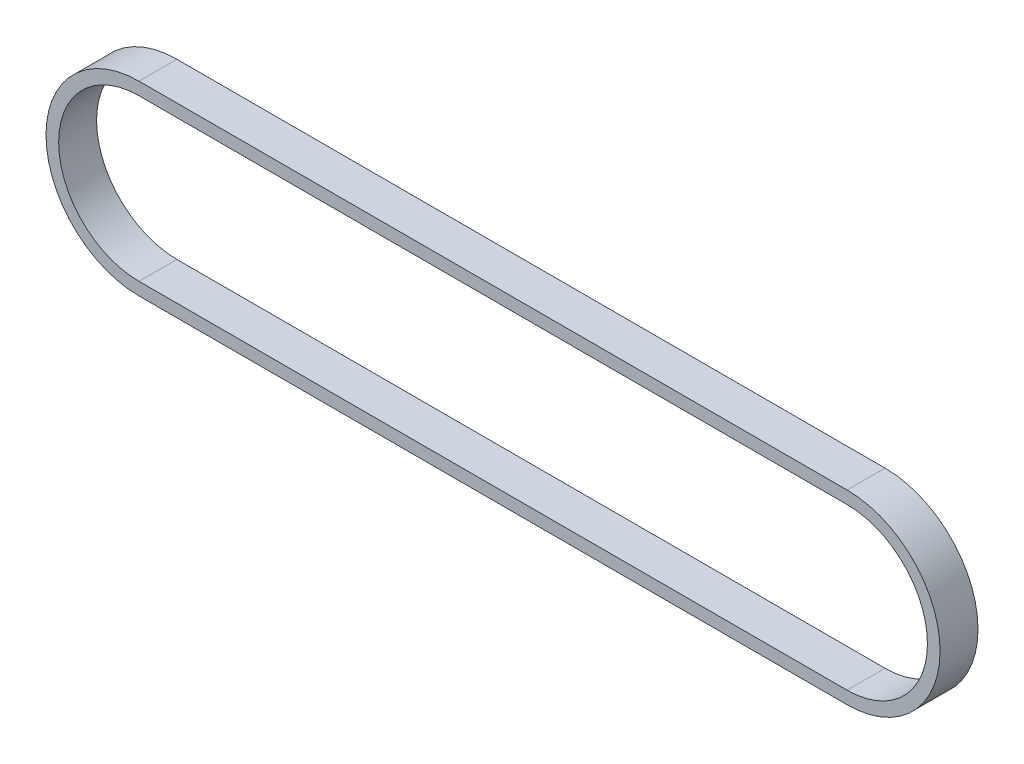
ISO-10303-21;
HEADER;
FILE_DESCRIPTION(('STEP AP214'),'2;1');
FILE_NAME('part.step','',(''),(''),'','','');
FILE_SCHEMA(('AUTOMOTIVE_DESIGN { 1 0 10303 214 1 1 1 1 }'));
ENDSEC;
DATA;
#1=APPLICATION_CONTEXT('core data for automotive mechanical design processes');
#2=APPLICATION_PROTOCOL_DEFINITION('international standard','automotive_design',2000,#1);
#3=PRODUCT_CONTEXT('',#1,'mechanical');
#4=PRODUCT('Part','Part','',(#3));
#5=PRODUCT_RELATED_PRODUCT_CATEGORY('part','',(#4));
#6=PRODUCT_DEFINITION_FORMATION('','',#4);
#7=PRODUCT_DEFINITION_CONTEXT('part definition',#1,'design');
#8=PRODUCT_DEFINITION('design','',#6,#7);
#9=PRODUCT_DEFINITION_SHAPE('','',#8);
#10=(LENGTH_UNIT() NAMED_UNIT(*) SI_UNIT(.MILLI.,.METRE.));
#11=(NAMED_UNIT(*) PLANE_ANGLE_UNIT() SI_UNIT($,.RADIAN.));
#12=(NAMED_UNIT(*) SI_UNIT($,.STERADIAN.) SOLID_ANGLE_UNIT());
#13=UNCERTAINTY_MEASURE_WITH_UNIT(LENGTH_MEASURE(1.E-05),#10,'distance_accuracy_value','');
#14=(GEOMETRIC_REPRESENTATION_CONTEXT(3) GLOBAL_UNCERTAINTY_ASSIGNED_CONTEXT((#13)) GLOBAL_UNIT_ASSIGNED_CONTEXT((#10,
#11,#12)) REPRESENTATION_CONTEXT('',''));
#15=CARTESIAN_POINT('',(0.,0.,0.));
#16=DIRECTION('',(0.,0.,1.));
#17=DIRECTION('',(1.,0.,0.));
#18=AXIS2_PLACEMENT_3D('',#15,#16,#17);
#19=CARTESIAN_POINT('',(0.,0.,6.));
#20=DIRECTION('',(0.,0.,1.));
#21=DIRECTION('',(1.,0.,0.));
#22=AXIS2_PLACEMENT_3D('',#19,#20,#21);
#23=PLANE('',#22);
#24=CARTESIAN_POINT('',(0.,0.,6.));
#25=DIRECTION('',(0.,0.,1.));
#26=DIRECTION('',(1.,0.,0.));
#27=AXIS2_PLACEMENT_3D('',#24,#25,#26);
#28=CIRCLE('',#27,14.71);
#29=CARTESIAN_POINT('',(0.,14.71,6.));
#30=VERTEX_POINT('',#29);
#31=CARTESIAN_POINT('',(0.,-14.71,6.));
#32=VERTEX_POINT('',#31);
#33=EDGE_CURVE('E134',#30,#32,#28,.T.);
#34=ORIENTED_EDGE('',*,*,#33,.T.);
#35=DIRECTION('',(1.,0.,0.));
#36=VECTOR('',#35,1.);
#37=CARTESIAN_POINT('',(0.,-14.71,6.));
#38=LINE('',#37,#36);
#39=CARTESIAN_POINT('',(112.,-14.71,6.));
#40=VERTEX_POINT('',#39);
#41=EDGE_CURVE('E137',#32,#40,#38,.T.);
#42=ORIENTED_EDGE('',*,*,#41,.T.);
#43=CARTESIAN_POINT('',(112.,0.,6.));
#44=DIRECTION('',(0.,0.,1.));
#45=DIRECTION('',(1.,0.,0.));
#46=AXIS2_PLACEMENT_3D('',#43,#44,#45);
#47=CIRCLE('',#46,14.71);
#48=CARTESIAN_POINT('',(112.,14.71,6.));
#49=VERTEX_POINT('',#48);
#50=EDGE_CURVE('E140',#40,#49,#47,.T.);
#51=ORIENTED_EDGE('',*,*,#50,.T.);
#52=DIRECTION('',(-1.,0.,0.));
#53=VECTOR('',#52,1.);
#54=CARTESIAN_POINT('',(0.,14.71,6.));
#55=LINE('',#54,#53);
#56=EDGE_CURVE('E142',#49,#30,#55,.T.);
#57=ORIENTED_EDGE('',*,*,#56,.T.);
#58=EDGE_LOOP('',(#34,#42,#51,#57));
#59=FACE_BOUND('',#58,.T.);
#60=DIRECTION('',(1.,0.,0.));
#61=VECTOR('',#60,1.);
#62=CARTESIAN_POINT('',(0.,-12.71,6.));
#63=LINE('',#62,#61);
#64=CARTESIAN_POINT('',(0.,-12.71,6.));
#65=VERTEX_POINT('',#64);
#66=CARTESIAN_POINT('',(112.,-12.71,6.));
#67=VERTEX_POINT('',#66);
#68=EDGE_CURVE('E106',#65,#67,#63,.T.);
#69=ORIENTED_EDGE('',*,*,#68,.F.);
#70=CARTESIAN_POINT('',(0.,0.,6.));
#71=DIRECTION('',(0.,0.,1.));
#72=DIRECTION('',(1.,0.,0.));
#73=AXIS2_PLACEMENT_3D('',#70,#71,#72);
#74=CIRCLE('',#73,12.71);
#75=CARTESIAN_POINT('',(0.,12.71,6.));
#76=VERTEX_POINT('',#75);
#77=EDGE_CURVE('E98',#76,#65,#74,.T.);
#78=ORIENTED_EDGE('',*,*,#77,.F.);
#79=DIRECTION('',(-1.,0.,0.));
#80=VECTOR('',#79,1.);
#81=CARTESIAN_POINT('',(0.,12.71,6.));
#82=LINE('',#81,#80);
#83=CARTESIAN_POINT('',(112.,12.71,6.));
#84=VERTEX_POINT('',#83);
#85=EDGE_CURVE('E120',#84,#76,#82,.T.);
#86=ORIENTED_EDGE('',*,*,#85,.F.);
#87=CARTESIAN_POINT('',(112.,0.,6.));
#88=DIRECTION('',(0.,0.,1.));
#89=DIRECTION('',(1.,0.,0.));
#90=AXIS2_PLACEMENT_3D('',#87,#88,#89);
#91=CIRCLE('',#90,12.71);
#92=EDGE_CURVE('E118',#67,#84,#91,.T.);
#93=ORIENTED_EDGE('',*,*,#92,.F.);
#94=EDGE_LOOP('',(#69,#78,#86,#93));
#95=FACE_BOUND('',#94,.T.);
#96=ADVANCED_FACE('F33',(#59,#95),#23,.T.);
#97=CARTESIAN_POINT('',(0.,0.,0.));
#98=DIRECTION('',(0.,0.,1.));
#99=DIRECTION('',(1.,0.,0.));
#100=AXIS2_PLACEMENT_3D('',#97,#98,#99);
#101=PLANE('',#100);
#102=CARTESIAN_POINT('',(0.,0.,0.));
#103=DIRECTION('',(0.,0.,1.));
#104=DIRECTION('',(1.,0.,0.));
#105=AXIS2_PLACEMENT_3D('',#102,#103,#104);
#106=CIRCLE('',#105,14.71);
#107=CARTESIAN_POINT('',(0.,14.71,0.));
#108=VERTEX_POINT('',#107);
#109=CARTESIAN_POINT('',(0.,-14.71,0.));
#110=VERTEX_POINT('',#109);
#111=EDGE_CURVE('E114',#108,#110,#106,.T.);
#112=ORIENTED_EDGE('',*,*,#111,.F.);
#113=DIRECTION('',(-1.,0.,0.));
#114=VECTOR('',#113,1.);
#115=CARTESIAN_POINT('',(0.,14.71,0.));
#116=LINE('',#115,#114);
#117=CARTESIAN_POINT('',(112.,14.71,0.));
#118=VERTEX_POINT('',#117);
#119=EDGE_CURVE('E138',#118,#108,#116,.T.);
#120=ORIENTED_EDGE('',*,*,#119,.F.);
#121=CARTESIAN_POINT('',(112.,0.,0.));
#122=DIRECTION('',(0.,0.,1.));
#123=DIRECTION('',(1.,0.,0.));
#124=AXIS2_PLACEMENT_3D('',#121,#122,#123);
#125=CIRCLE('',#124,14.71);
#126=CARTESIAN_POINT('',(112.,-14.71,0.));
#127=VERTEX_POINT('',#126);
#128=EDGE_CURVE('E149',#127,#118,#125,.T.);
#129=ORIENTED_EDGE('',*,*,#128,.F.);
#130=DIRECTION('',(1.,0.,0.));
#131=VECTOR('',#130,1.);
#132=CARTESIAN_POINT('',(0.,-14.71,0.));
#133=LINE('',#132,#131);
#134=EDGE_CURVE('E147',#110,#127,#133,.T.);
#135=ORIENTED_EDGE('',*,*,#134,.F.);
#136=EDGE_LOOP('',(#112,#120,#129,#135));
#137=FACE_BOUND('',#136,.T.);
#138=CARTESIAN_POINT('',(0.,0.,0.));
#139=DIRECTION('',(0.,0.,1.));
#140=DIRECTION('',(1.,0.,0.));
#141=AXIS2_PLACEMENT_3D('',#138,#139,#140);
#142=CIRCLE('',#141,12.71);
#143=CARTESIAN_POINT('',(0.,12.71,0.));
#144=VERTEX_POINT('',#143);
#145=CARTESIAN_POINT('',(0.,-12.71,0.));
#146=VERTEX_POINT('',#145);
#147=EDGE_CURVE('E56',#144,#146,#142,.T.);
#148=ORIENTED_EDGE('',*,*,#147,.T.);
#149=DIRECTION('',(1.,0.,0.));
#150=VECTOR('',#149,1.);
#151=CARTESIAN_POINT('',(0.,-12.71,0.));
#152=LINE('',#151,#150);
#153=CARTESIAN_POINT('',(112.,-12.71,0.));
#154=VERTEX_POINT('',#153);
#155=EDGE_CURVE('E113',#146,#154,#152,.T.);
#156=ORIENTED_EDGE('',*,*,#155,.T.);
#157=CARTESIAN_POINT('',(112.,0.,0.));
#158=DIRECTION('',(0.,0.,1.));
#159=DIRECTION('',(1.,0.,0.));
#160=AXIS2_PLACEMENT_3D('',#157,#158,#159);
#161=CIRCLE('',#160,12.71);
#162=CARTESIAN_POINT('',(112.,12.71,0.));
#163=VERTEX_POINT('',#162);
#164=EDGE_CURVE('E126',#154,#163,#161,.T.);
#165=ORIENTED_EDGE('',*,*,#164,.T.);
#166=DIRECTION('',(-1.,0.,0.));
#167=VECTOR('',#166,1.);
#168=CARTESIAN_POINT('',(0.,12.71,0.));
#169=LINE('',#168,#167);
#170=EDGE_CURVE('E107',#163,#144,#169,.T.);
#171=ORIENTED_EDGE('',*,*,#170,.T.);
#172=EDGE_LOOP('',(#148,#156,#165,#171));
#173=FACE_BOUND('',#172,.T.);
#174=ADVANCED_FACE('F167',(#137,#173),#101,.F.);
#175=CARTESIAN_POINT('',(0.,0.,6.));
#176=DIRECTION('',(0.,0.,-1.));
#177=DIRECTION('',(-1.,0.,0.));
#178=AXIS2_PLACEMENT_3D('',#175,#176,#177);
#179=CYLINDRICAL_SURFACE('',#178,14.71);
#180=ORIENTED_EDGE('',*,*,#111,.T.);
#181=DIRECTION('',(0.,0.,-1.));
#182=VECTOR('',#181,1.);
#183=CARTESIAN_POINT('',(0.,-14.71,6.));
#184=LINE('',#183,#182);
#185=EDGE_CURVE('E11',#32,#110,#184,.T.);
#186=ORIENTED_EDGE('',*,*,#185,.F.);
#187=ORIENTED_EDGE('',*,*,#33,.F.);
#188=DIRECTION('',(0.,0.,-1.));
#189=VECTOR('',#188,1.);
#190=CARTESIAN_POINT('',(0.,14.71,6.));
#191=LINE('',#190,#189);
#192=EDGE_CURVE('E144',#30,#108,#191,.T.);
#193=ORIENTED_EDGE('',*,*,#192,.T.);
#194=EDGE_LOOP('',(#180,#186,#187,#193));
#195=FACE_BOUND('',#194,.T.);
#196=ADVANCED_FACE('F35',(#195),#179,.T.);
#197=CARTESIAN_POINT('',(0.,-14.71,6.));
#198=DIRECTION('',(0.,1.,0.));
#199=DIRECTION('',(0.,0.,1.));
#200=AXIS2_PLACEMENT_3D('',#197,#198,#199);
#201=PLANE('',#200);
#202=ORIENTED_EDGE('',*,*,#134,.T.);
#203=DIRECTION('',(0.,0.,-1.));
#204=VECTOR('',#203,1.);
#205=CARTESIAN_POINT('',(112.,-14.71,6.));
#206=LINE('',#205,#204);
#207=EDGE_CURVE('E41',#40,#127,#206,.T.);
#208=ORIENTED_EDGE('',*,*,#207,.F.);
#209=ORIENTED_EDGE('',*,*,#41,.F.);
#210=ORIENTED_EDGE('',*,*,#185,.T.);
#211=EDGE_LOOP('',(#202,#208,#209,#210));
#212=FACE_BOUND('',#211,.T.);
#213=ADVANCED_FACE('F177',(#212),#201,.F.);
#214=CARTESIAN_POINT('',(112.,0.,6.));
#215=DIRECTION('',(0.,0.,-1.));
#216=DIRECTION('',(-1.,0.,0.));
#217=AXIS2_PLACEMENT_3D('',#214,#215,#216);
#218=CYLINDRICAL_SURFACE('',#217,14.71);
#219=ORIENTED_EDGE('',*,*,#128,.T.);
#220=DIRECTION('',(0.,0.,-1.));
#221=VECTOR('',#220,1.);
#222=CARTESIAN_POINT('',(112.,14.71,6.));
#223=LINE('',#222,#221);
#224=EDGE_CURVE('E154',#49,#118,#223,.T.);
#225=ORIENTED_EDGE('',*,*,#224,.F.);
#226=ORIENTED_EDGE('',*,*,#50,.F.);
#227=ORIENTED_EDGE('',*,*,#207,.T.);
#228=EDGE_LOOP('',(#219,#225,#226,#227));
#229=FACE_BOUND('',#228,.T.);
#230=ADVANCED_FACE('F161',(#229),#218,.T.);
#231=CARTESIAN_POINT('',(0.,14.71,6.));
#232=DIRECTION('',(0.,-1.,0.));
#233=DIRECTION('',(0.,0.,-1.));
#234=AXIS2_PLACEMENT_3D('',#231,#232,#233);
#235=PLANE('',#234);
#236=ORIENTED_EDGE('',*,*,#119,.T.);
#237=ORIENTED_EDGE('',*,*,#192,.F.);
#238=ORIENTED_EDGE('',*,*,#56,.F.);
#239=ORIENTED_EDGE('',*,*,#224,.T.);
#240=EDGE_LOOP('',(#236,#237,#238,#239));
#241=FACE_BOUND('',#240,.T.);
#242=ADVANCED_FACE('F171',(#241),#235,.F.);
#243=CARTESIAN_POINT('',(0.,0.,6.));
#244=DIRECTION('',(0.,0.,-1.));
#245=DIRECTION('',(-1.,0.,0.));
#246=AXIS2_PLACEMENT_3D('',#243,#244,#245);
#247=CYLINDRICAL_SURFACE('',#246,12.71);
#248=ORIENTED_EDGE('',*,*,#147,.F.);
#249=DIRECTION('',(0.,0.,-1.));
#250=VECTOR('',#249,1.);
#251=CARTESIAN_POINT('',(0.,12.71,6.));
#252=LINE('',#251,#250);
#253=EDGE_CURVE('E102',#76,#144,#252,.T.);
#254=ORIENTED_EDGE('',*,*,#253,.F.);
#255=ORIENTED_EDGE('',*,*,#77,.T.);
#256=DIRECTION('',(0.,0.,-1.));
#257=VECTOR('',#256,1.);
#258=CARTESIAN_POINT('',(0.,-12.71,6.));
#259=LINE('',#258,#257);
#260=EDGE_CURVE('E101',#65,#146,#259,.T.);
#261=ORIENTED_EDGE('',*,*,#260,.T.);
#262=EDGE_LOOP('',(#248,#254,#255,#261));
#263=FACE_BOUND('',#262,.T.);
#264=ADVANCED_FACE('F100',(#263),#247,.F.);
#265=CARTESIAN_POINT('',(0.,-12.71,6.));
#266=DIRECTION('',(0.,1.,0.));
#267=DIRECTION('',(0.,0.,1.));
#268=AXIS2_PLACEMENT_3D('',#265,#266,#267);
#269=PLANE('',#268);
#270=ORIENTED_EDGE('',*,*,#155,.F.);
#271=ORIENTED_EDGE('',*,*,#260,.F.);
#272=ORIENTED_EDGE('',*,*,#68,.T.);
#273=DIRECTION('',(0.,0.,-1.));
#274=VECTOR('',#273,1.);
#275=CARTESIAN_POINT('',(112.,-12.71,6.));
#276=LINE('',#275,#274);
#277=EDGE_CURVE('E115',#67,#154,#276,.T.);
#278=ORIENTED_EDGE('',*,*,#277,.T.);
#279=EDGE_LOOP('',(#270,#271,#272,#278));
#280=FACE_BOUND('',#279,.T.);
#281=ADVANCED_FACE('F110',(#280),#269,.T.);
#282=CARTESIAN_POINT('',(112.,0.,6.));
#283=DIRECTION('',(0.,0.,-1.));
#284=DIRECTION('',(-1.,0.,0.));
#285=AXIS2_PLACEMENT_3D('',#282,#283,#284);
#286=CYLINDRICAL_SURFACE('',#285,12.71);
#287=ORIENTED_EDGE('',*,*,#164,.F.);
#288=ORIENTED_EDGE('',*,*,#277,.F.);
#289=ORIENTED_EDGE('',*,*,#92,.T.);
#290=DIRECTION('',(0.,0.,-1.));
#291=VECTOR('',#290,1.);
#292=CARTESIAN_POINT('',(112.,12.71,6.));
#293=LINE('',#292,#291);
#294=EDGE_CURVE('E48',#84,#163,#293,.T.);
#295=ORIENTED_EDGE('',*,*,#294,.T.);
#296=EDGE_LOOP('',(#287,#288,#289,#295));
#297=FACE_BOUND('',#296,.T.);
#298=ADVANCED_FACE('F200',(#297),#286,.F.);
#299=CARTESIAN_POINT('',(0.,12.71,6.));
#300=DIRECTION('',(0.,-1.,0.));
#301=DIRECTION('',(0.,0.,-1.));
#302=AXIS2_PLACEMENT_3D('',#299,#300,#301);
#303=PLANE('',#302);
#304=ORIENTED_EDGE('',*,*,#170,.F.);
#305=ORIENTED_EDGE('',*,*,#294,.F.);
#306=ORIENTED_EDGE('',*,*,#85,.T.);
#307=ORIENTED_EDGE('',*,*,#253,.T.);
#308=EDGE_LOOP('',(#304,#305,#306,#307));
#309=FACE_BOUND('',#308,.T.);
#310=ADVANCED_FACE('F204',(#309),#303,.T.);
#311=CLOSED_SHELL('',(#96,#174,#196,#213,#230,#242,#264,#281,#298,#310));
#312=MANIFOLD_SOLID_BREP('B2',#311);
#313=ADVANCED_BREP_SHAPE_REPRESENTATION('',(#18,#312),#14);
#314=SHAPE_DEFINITION_REPRESENTATION(#9,#313);
ENDSEC;
END-ISO-10303-21;
